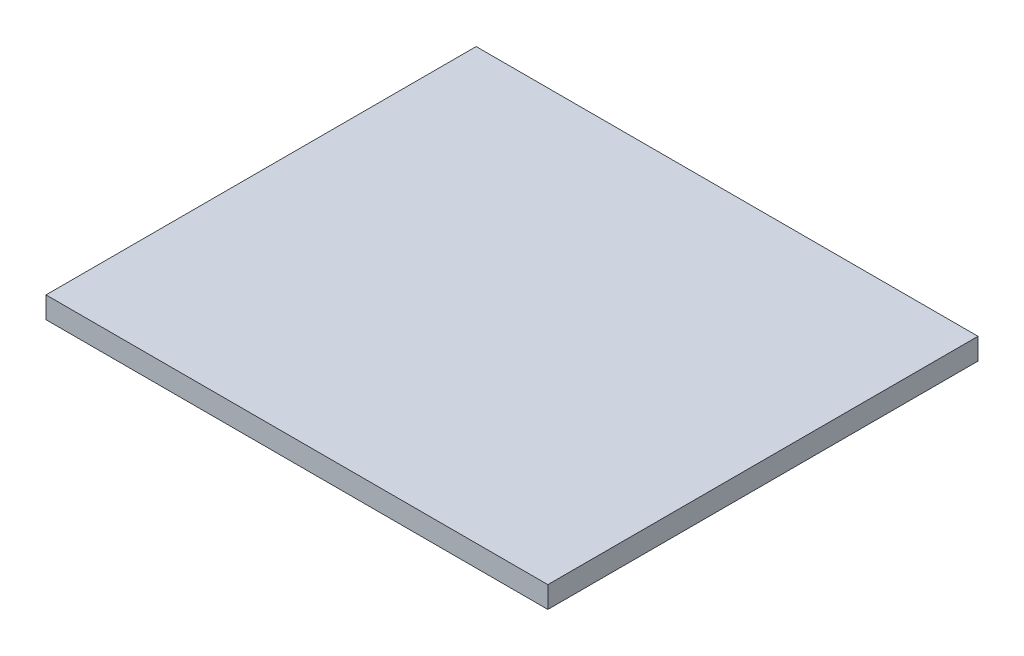
ISO-10303-21;
HEADER;
FILE_DESCRIPTION(('STEP AP214'),'2;1');
FILE_NAME('part.step','',(''),(''),'','','');
FILE_SCHEMA(('AUTOMOTIVE_DESIGN { 1 0 10303 214 1 1 1 1 }'));
ENDSEC;
DATA;
#1=APPLICATION_CONTEXT('core data for automotive mechanical design processes');
#2=APPLICATION_PROTOCOL_DEFINITION('international standard','automotive_design',2000,#1);
#3=PRODUCT_CONTEXT('',#1,'mechanical');
#4=PRODUCT('Part','Part','',(#3));
#5=PRODUCT_RELATED_PRODUCT_CATEGORY('part','',(#4));
#6=PRODUCT_DEFINITION_FORMATION('','',#4);
#7=PRODUCT_DEFINITION_CONTEXT('part definition',#1,'design');
#8=PRODUCT_DEFINITION('design','',#6,#7);
#9=PRODUCT_DEFINITION_SHAPE('','',#8);
#10=(LENGTH_UNIT() NAMED_UNIT(*) SI_UNIT(.MILLI.,.METRE.));
#11=(NAMED_UNIT(*) PLANE_ANGLE_UNIT() SI_UNIT($,.RADIAN.));
#12=(NAMED_UNIT(*) SI_UNIT($,.STERADIAN.) SOLID_ANGLE_UNIT());
#13=UNCERTAINTY_MEASURE_WITH_UNIT(LENGTH_MEASURE(1.E-05),#10,'distance_accuracy_value','');
#14=(GEOMETRIC_REPRESENTATION_CONTEXT(3) GLOBAL_UNCERTAINTY_ASSIGNED_CONTEXT((#13)) GLOBAL_UNIT_ASSIGNED_CONTEXT((#10,
#11,#12)) REPRESENTATION_CONTEXT('',''));
#15=CARTESIAN_POINT('',(0.,0.,0.));
#16=DIRECTION('',(0.,0.,1.));
#17=DIRECTION('',(1.,0.,0.));
#18=AXIS2_PLACEMENT_3D('',#15,#16,#17);
#19=CARTESIAN_POINT('',(-35.,3.,30.));
#20=DIRECTION('',(0.,0.,-1.));
#21=DIRECTION('',(-1.,0.,0.));
#22=AXIS2_PLACEMENT_3D('',#19,#20,#21);
#23=PLANE('',#22);
#24=DIRECTION('',(1.,0.,0.));
#25=VECTOR('',#24,1.);
#26=CARTESIAN_POINT('',(-35.,0.,30.));
#27=LINE('',#26,#25);
#28=CARTESIAN_POINT('',(-35.,0.,30.));
#29=VERTEX_POINT('',#28);
#30=CARTESIAN_POINT('',(35.,0.,30.));
#31=VERTEX_POINT('',#30);
#32=EDGE_CURVE('E96',#29,#31,#27,.T.);
#33=ORIENTED_EDGE('',*,*,#32,.T.);
#34=DIRECTION('',(0.,-1.,0.));
#35=VECTOR('',#34,1.);
#36=CARTESIAN_POINT('',(35.,3.,30.));
#37=LINE('',#36,#35);
#38=CARTESIAN_POINT('',(35.,3.,30.));
#39=VERTEX_POINT('',#38);
#40=EDGE_CURVE('E11',#39,#31,#37,.T.);
#41=ORIENTED_EDGE('',*,*,#40,.F.);
#42=DIRECTION('',(1.,0.,0.));
#43=VECTOR('',#42,1.);
#44=CARTESIAN_POINT('',(-35.,3.,30.));
#45=LINE('',#44,#43);
#46=CARTESIAN_POINT('',(-35.,3.,30.));
#47=VERTEX_POINT('',#46);
#48=EDGE_CURVE('E82',#47,#39,#45,.T.);
#49=ORIENTED_EDGE('',*,*,#48,.F.);
#50=DIRECTION('',(0.,-1.,0.));
#51=VECTOR('',#50,1.);
#52=CARTESIAN_POINT('',(-35.,3.,30.));
#53=LINE('',#52,#51);
#54=EDGE_CURVE('E49',#47,#29,#53,.T.);
#55=ORIENTED_EDGE('',*,*,#54,.T.);
#56=EDGE_LOOP('',(#33,#41,#49,#55));
#57=FACE_BOUND('',#56,.T.);
#58=ADVANCED_FACE('F33',(#57),#23,.F.);
#59=CARTESIAN_POINT('',(35.,3.,30.));
#60=DIRECTION('',(-1.,0.,0.));
#61=DIRECTION('',(0.,0.,1.));
#62=AXIS2_PLACEMENT_3D('',#59,#60,#61);
#63=PLANE('',#62);
#64=DIRECTION('',(0.,0.,-1.));
#65=VECTOR('',#64,1.);
#66=CARTESIAN_POINT('',(35.,0.,30.));
#67=LINE('',#66,#65);
#68=CARTESIAN_POINT('',(35.,0.,-30.));
#69=VERTEX_POINT('',#68);
#70=EDGE_CURVE('E87',#31,#69,#67,.T.);
#71=ORIENTED_EDGE('',*,*,#70,.T.);
#72=DIRECTION('',(0.,-1.,0.));
#73=VECTOR('',#72,1.);
#74=CARTESIAN_POINT('',(35.,3.,-30.));
#75=LINE('',#74,#73);
#76=CARTESIAN_POINT('',(35.,3.,-30.));
#77=VERTEX_POINT('',#76);
#78=EDGE_CURVE('E41',#77,#69,#75,.T.);
#79=ORIENTED_EDGE('',*,*,#78,.F.);
#80=DIRECTION('',(0.,0.,-1.));
#81=VECTOR('',#80,1.);
#82=CARTESIAN_POINT('',(35.,3.,30.));
#83=LINE('',#82,#81);
#84=EDGE_CURVE('E74',#39,#77,#83,.T.);
#85=ORIENTED_EDGE('',*,*,#84,.F.);
#86=ORIENTED_EDGE('',*,*,#40,.T.);
#87=EDGE_LOOP('',(#71,#79,#85,#86));
#88=FACE_BOUND('',#87,.T.);
#89=ADVANCED_FACE('F86',(#88),#63,.F.);
#90=CARTESIAN_POINT('',(-35.,3.,-30.));
#91=DIRECTION('',(0.,0.,-1.));
#92=DIRECTION('',(-1.,0.,0.));
#93=AXIS2_PLACEMENT_3D('',#90,#91,#92);
#94=PLANE('',#93);
#95=DIRECTION('',(1.,0.,0.));
#96=VECTOR('',#95,1.);
#97=CARTESIAN_POINT('',(-35.,0.,-30.));
#98=LINE('',#97,#96);
#99=CARTESIAN_POINT('',(-35.,0.,-30.));
#100=VERTEX_POINT('',#99);
#101=EDGE_CURVE('E99',#100,#69,#98,.T.);
#102=ORIENTED_EDGE('',*,*,#101,.F.);
#103=DIRECTION('',(0.,-1.,0.));
#104=VECTOR('',#103,1.);
#105=CARTESIAN_POINT('',(-35.,3.,-30.));
#106=LINE('',#105,#104);
#107=CARTESIAN_POINT('',(-35.,3.,-30.));
#108=VERTEX_POINT('',#107);
#109=EDGE_CURVE('E63',#108,#100,#106,.T.);
#110=ORIENTED_EDGE('',*,*,#109,.F.);
#111=DIRECTION('',(1.,0.,0.));
#112=VECTOR('',#111,1.);
#113=CARTESIAN_POINT('',(-35.,3.,-30.));
#114=LINE('',#113,#112);
#115=EDGE_CURVE('E81',#108,#77,#114,.T.);
#116=ORIENTED_EDGE('',*,*,#115,.T.);
#117=ORIENTED_EDGE('',*,*,#78,.T.);
#118=EDGE_LOOP('',(#102,#110,#116,#117));
#119=FACE_BOUND('',#118,.T.);
#120=ADVANCED_FACE('F90',(#119),#94,.T.);
#121=CARTESIAN_POINT('',(-35.,3.,30.));
#122=DIRECTION('',(-1.,0.,0.));
#123=DIRECTION('',(0.,0.,1.));
#124=AXIS2_PLACEMENT_3D('',#121,#122,#123);
#125=PLANE('',#124);
#126=DIRECTION('',(0.,0.,-1.));
#127=VECTOR('',#126,1.);
#128=CARTESIAN_POINT('',(-35.,0.,30.));
#129=LINE('',#128,#127);
#130=EDGE_CURVE('E101',#29,#100,#129,.T.);
#131=ORIENTED_EDGE('',*,*,#130,.F.);
#132=ORIENTED_EDGE('',*,*,#54,.F.);
#133=DIRECTION('',(0.,0.,-1.));
#134=VECTOR('',#133,1.);
#135=CARTESIAN_POINT('',(-35.,3.,30.));
#136=LINE('',#135,#134);
#137=EDGE_CURVE('E91',#47,#108,#136,.T.);
#138=ORIENTED_EDGE('',*,*,#137,.T.);
#139=ORIENTED_EDGE('',*,*,#109,.T.);
#140=EDGE_LOOP('',(#131,#132,#138,#139));
#141=FACE_BOUND('',#140,.T.);
#142=ADVANCED_FACE('F107',(#141),#125,.T.);
#143=CARTESIAN_POINT('',(0.,3.,0.));
#144=DIRECTION('',(0.,1.,0.));
#145=DIRECTION('',(0.,0.,1.));
#146=AXIS2_PLACEMENT_3D('',#143,#144,#145);
#147=PLANE('',#146);
#148=ORIENTED_EDGE('',*,*,#48,.T.);
#149=ORIENTED_EDGE('',*,*,#84,.T.);
#150=ORIENTED_EDGE('',*,*,#115,.F.);
#151=ORIENTED_EDGE('',*,*,#137,.F.);
#152=EDGE_LOOP('',(#148,#149,#150,#151));
#153=FACE_BOUND('',#152,.T.);
#154=ADVANCED_FACE('F78',(#153),#147,.T.);
#155=CARTESIAN_POINT('',(0.,0.,0.));
#156=DIRECTION('',(0.,1.,0.));
#157=DIRECTION('',(0.,0.,1.));
#158=AXIS2_PLACEMENT_3D('',#155,#156,#157);
#159=PLANE('',#158);
#160=ORIENTED_EDGE('',*,*,#32,.F.);
#161=ORIENTED_EDGE('',*,*,#130,.T.);
#162=ORIENTED_EDGE('',*,*,#101,.T.);
#163=ORIENTED_EDGE('',*,*,#70,.F.);
#164=EDGE_LOOP('',(#160,#161,#162,#163));
#165=FACE_BOUND('',#164,.T.);
#166=ADVANCED_FACE('F106',(#165),#159,.F.);
#167=CLOSED_SHELL('',(#58,#89,#120,#142,#154,#166));
#168=MANIFOLD_SOLID_BREP('B2',#167);
#169=ADVANCED_BREP_SHAPE_REPRESENTATION('',(#18,#168),#14);
#170=SHAPE_DEFINITION_REPRESENTATION(#9,#169);
ENDSEC;
END-ISO-10303-21;
